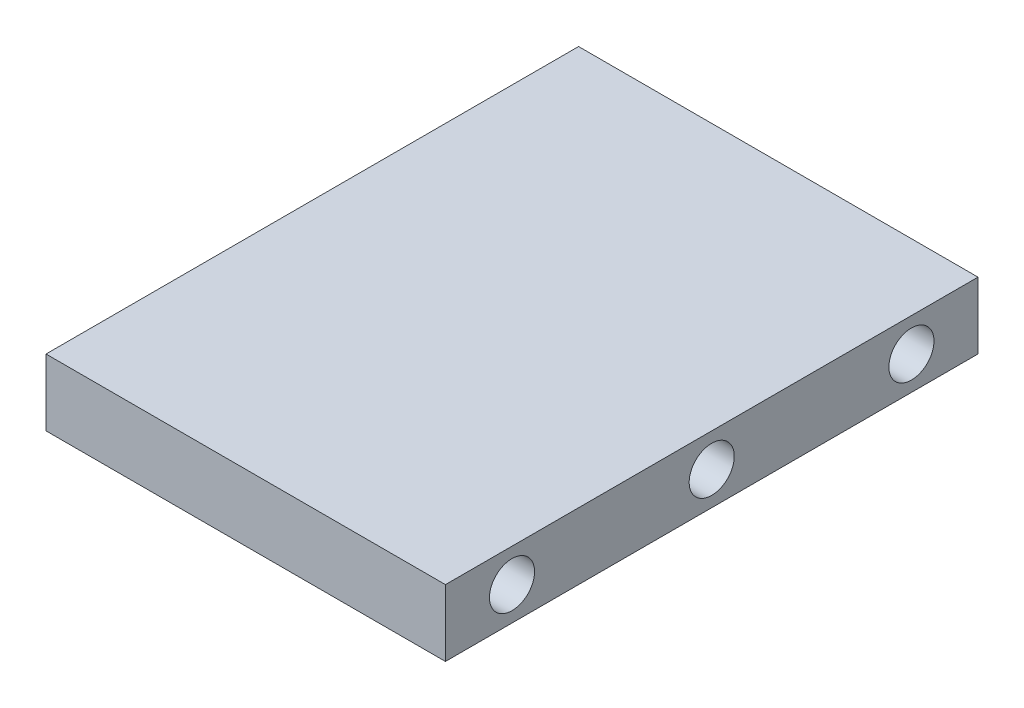
ISO-10303-21;
HEADER;
FILE_DESCRIPTION(('STEP AP214'),'2;1');
FILE_NAME('part.step','',(''),(''),'','','');
FILE_SCHEMA(('AUTOMOTIVE_DESIGN { 1 0 10303 214 1 1 1 1 }'));
ENDSEC;
DATA;
#1=APPLICATION_CONTEXT('core data for automotive mechanical design processes');
#2=APPLICATION_PROTOCOL_DEFINITION('international standard','automotive_design',2000,#1);
#3=PRODUCT_CONTEXT('',#1,'mechanical');
#4=PRODUCT('Part','Part','',(#3));
#5=PRODUCT_RELATED_PRODUCT_CATEGORY('part','',(#4));
#6=PRODUCT_DEFINITION_FORMATION('','',#4);
#7=PRODUCT_DEFINITION_CONTEXT('part definition',#1,'design');
#8=PRODUCT_DEFINITION('design','',#6,#7);
#9=PRODUCT_DEFINITION_SHAPE('','',#8);
#10=(LENGTH_UNIT() NAMED_UNIT(*) SI_UNIT(.MILLI.,.METRE.));
#11=(NAMED_UNIT(*) PLANE_ANGLE_UNIT() SI_UNIT($,.RADIAN.));
#12=(NAMED_UNIT(*) SI_UNIT($,.STERADIAN.) SOLID_ANGLE_UNIT());
#13=UNCERTAINTY_MEASURE_WITH_UNIT(LENGTH_MEASURE(1.E-05),#10,'distance_accuracy_value','');
#14=(GEOMETRIC_REPRESENTATION_CONTEXT(3) GLOBAL_UNCERTAINTY_ASSIGNED_CONTEXT((#13)) GLOBAL_UNIT_ASSIGNED_CONTEXT((#10,
#11,#12)) REPRESENTATION_CONTEXT('',''));
#15=CARTESIAN_POINT('',(0.,0.,0.));
#16=DIRECTION('',(0.,0.,1.));
#17=DIRECTION('',(1.,0.,0.));
#18=AXIS2_PLACEMENT_3D('',#15,#16,#17);
#19=CARTESIAN_POINT('',(19.05,6.35,25.4));
#20=DIRECTION('',(-1.,0.,0.));
#21=DIRECTION('',(0.,0.,1.));
#22=AXIS2_PLACEMENT_3D('',#19,#20,#21);
#23=PLANE('',#22);
#24=CARTESIAN_POINT('',(19.05,3.17500000000015,0.));
#25=DIRECTION('',(-1.,0.,0.));
#26=DIRECTION('',(0.,0.,1.));
#27=AXIS2_PLACEMENT_3D('',#24,#25,#26);
#28=CIRCLE('',#27,2.15265);
#29=CARTESIAN_POINT('',(19.05,3.17500000000015,2.15265));
#30=VERTEX_POINT('',#29);
#31=EDGE_CURVE('E121',#30,#30,#28,.T.);
#32=ORIENTED_EDGE('',*,*,#31,.T.);
#33=EDGE_LOOP('',(#32));
#34=FACE_BOUND('',#33,.T.);
#35=CARTESIAN_POINT('',(19.05,3.17500000000015,19.05));
#36=DIRECTION('',(-1.,0.,0.));
#37=DIRECTION('',(0.,0.,1.));
#38=AXIS2_PLACEMENT_3D('',#35,#36,#37);
#39=CIRCLE('',#38,2.15265);
#40=CARTESIAN_POINT('',(19.05,3.17500000000015,21.20265));
#41=VERTEX_POINT('',#40);
#42=EDGE_CURVE('E122',#41,#41,#39,.T.);
#43=ORIENTED_EDGE('',*,*,#42,.T.);
#44=EDGE_LOOP('',(#43));
#45=FACE_BOUND('',#44,.T.);
#46=CARTESIAN_POINT('',(19.05,3.17500000000015,-19.05));
#47=DIRECTION('',(-1.,0.,0.));
#48=DIRECTION('',(0.,0.,1.));
#49=AXIS2_PLACEMENT_3D('',#46,#47,#48);
#50=CIRCLE('',#49,2.15265);
#51=CARTESIAN_POINT('',(19.05,3.17500000000015,-16.89735));
#52=VERTEX_POINT('',#51);
#53=EDGE_CURVE('E116',#52,#52,#50,.T.);
#54=ORIENTED_EDGE('',*,*,#53,.T.);
#55=EDGE_LOOP('',(#54));
#56=FACE_BOUND('',#55,.T.);
#57=DIRECTION('',(0.,0.,-1.));
#58=VECTOR('',#57,1.);
#59=CARTESIAN_POINT('',(19.05,0.,25.4));
#60=LINE('',#59,#58);
#61=CARTESIAN_POINT('',(19.05,0.,25.4));
#62=VERTEX_POINT('',#61);
#63=CARTESIAN_POINT('',(19.05,0.,-25.4));
#64=VERTEX_POINT('',#63);
#65=EDGE_CURVE('E96',#62,#64,#60,.T.);
#66=ORIENTED_EDGE('',*,*,#65,.T.);
#67=DIRECTION('',(0.,-1.,0.));
#68=VECTOR('',#67,1.);
#69=CARTESIAN_POINT('',(19.05,6.35,-25.4));
#70=LINE('',#69,#68);
#71=CARTESIAN_POINT('',(19.05,6.35,-25.4));
#72=VERTEX_POINT('',#71);
#73=EDGE_CURVE('E11',#72,#64,#70,.T.);
#74=ORIENTED_EDGE('',*,*,#73,.F.);
#75=DIRECTION('',(0.,0.,-1.));
#76=VECTOR('',#75,1.);
#77=CARTESIAN_POINT('',(19.05,6.35,25.4));
#78=LINE('',#77,#76);
#79=CARTESIAN_POINT('',(19.05,6.35,25.4));
#80=VERTEX_POINT('',#79);
#81=EDGE_CURVE('E84',#80,#72,#78,.T.);
#82=ORIENTED_EDGE('',*,*,#81,.F.);
#83=DIRECTION('',(0.,-1.,0.));
#84=VECTOR('',#83,1.);
#85=CARTESIAN_POINT('',(19.05,6.35,25.4));
#86=LINE('',#85,#84);
#87=EDGE_CURVE('E92',#80,#62,#86,.T.);
#88=ORIENTED_EDGE('',*,*,#87,.T.);
#89=EDGE_LOOP('',(#66,#74,#82,#88));
#90=FACE_BOUND('',#89,.T.);
#91=ADVANCED_FACE('F33',(#34,#45,#56,#90),#23,.F.);
#92=CARTESIAN_POINT('',(-19.05,6.35,-25.4));
#93=DIRECTION('',(0.,0.,1.));
#94=DIRECTION('',(1.,0.,0.));
#95=AXIS2_PLACEMENT_3D('',#92,#93,#94);
#96=PLANE('',#95);
#97=DIRECTION('',(-1.,0.,0.));
#98=VECTOR('',#97,1.);
#99=CARTESIAN_POINT('',(-19.05,0.,-25.4));
#100=LINE('',#99,#98);
#101=CARTESIAN_POINT('',(-19.05,0.,-25.4));
#102=VERTEX_POINT('',#101);
#103=EDGE_CURVE('E88',#64,#102,#100,.T.);
#104=ORIENTED_EDGE('',*,*,#103,.T.);
#105=DIRECTION('',(0.,-1.,0.));
#106=VECTOR('',#105,1.);
#107=CARTESIAN_POINT('',(-19.05,6.35,-25.4));
#108=LINE('',#107,#106);
#109=CARTESIAN_POINT('',(-19.05,6.35,-25.4));
#110=VERTEX_POINT('',#109);
#111=EDGE_CURVE('E41',#110,#102,#108,.T.);
#112=ORIENTED_EDGE('',*,*,#111,.F.);
#113=DIRECTION('',(-1.,0.,0.));
#114=VECTOR('',#113,1.);
#115=CARTESIAN_POINT('',(-19.05,6.35,-25.4));
#116=LINE('',#115,#114);
#117=EDGE_CURVE('E79',#72,#110,#116,.T.);
#118=ORIENTED_EDGE('',*,*,#117,.F.);
#119=ORIENTED_EDGE('',*,*,#73,.T.);
#120=EDGE_LOOP('',(#104,#112,#118,#119));
#121=FACE_BOUND('',#120,.T.);
#122=ADVANCED_FACE('F87',(#121),#96,.F.);
#123=CARTESIAN_POINT('',(-19.05,6.35,25.4));
#124=DIRECTION('',(1.,0.,0.));
#125=DIRECTION('',(0.,0.,-1.));
#126=AXIS2_PLACEMENT_3D('',#123,#124,#125);
#127=PLANE('',#126);
#128=CARTESIAN_POINT('',(-19.05,3.17500000000015,0.));
#129=DIRECTION('',(-1.,0.,0.));
#130=DIRECTION('',(0.,0.,1.));
#131=AXIS2_PLACEMENT_3D('',#128,#129,#130);
#132=CIRCLE('',#131,2.15265);
#133=CARTESIAN_POINT('',(-19.05,3.17500000000015,2.15265));
#134=VERTEX_POINT('',#133);
#135=EDGE_CURVE('E112',#134,#134,#132,.T.);
#136=ORIENTED_EDGE('',*,*,#135,.F.);
#137=EDGE_LOOP('',(#136));
#138=FACE_BOUND('',#137,.T.);
#139=CARTESIAN_POINT('',(-19.05,3.17500000000015,19.05));
#140=DIRECTION('',(-1.,0.,0.));
#141=DIRECTION('',(0.,0.,1.));
#142=AXIS2_PLACEMENT_3D('',#139,#140,#141);
#143=CIRCLE('',#142,2.15265);
#144=CARTESIAN_POINT('',(-19.05,3.17500000000015,21.20265));
#145=VERTEX_POINT('',#144);
#146=EDGE_CURVE('E113',#145,#145,#143,.T.);
#147=ORIENTED_EDGE('',*,*,#146,.F.);
#148=EDGE_LOOP('',(#147));
#149=FACE_BOUND('',#148,.T.);
#150=CARTESIAN_POINT('',(-19.05,3.17500000000015,-19.05));
#151=DIRECTION('',(-1.,0.,0.));
#152=DIRECTION('',(0.,0.,1.));
#153=AXIS2_PLACEMENT_3D('',#150,#151,#152);
#154=CIRCLE('',#153,2.15265);
#155=CARTESIAN_POINT('',(-19.05,3.17500000000015,-16.89735));
#156=VERTEX_POINT('',#155);
#157=EDGE_CURVE('E99',#156,#156,#154,.T.);
#158=ORIENTED_EDGE('',*,*,#157,.F.);
#159=EDGE_LOOP('',(#158));
#160=FACE_BOUND('',#159,.T.);
#161=DIRECTION('',(0.,0.,1.));
#162=VECTOR('',#161,1.);
#163=CARTESIAN_POINT('',(-19.05,0.,25.4));
#164=LINE('',#163,#162);
#165=CARTESIAN_POINT('',(-19.05,0.,25.4));
#166=VERTEX_POINT('',#165);
#167=EDGE_CURVE('E66',#102,#166,#164,.T.);
#168=ORIENTED_EDGE('',*,*,#167,.T.);
#169=DIRECTION('',(0.,-1.,0.));
#170=VECTOR('',#169,1.);
#171=CARTESIAN_POINT('',(-19.05,6.35,25.4));
#172=LINE('',#171,#170);
#173=CARTESIAN_POINT('',(-19.05,6.35,25.4));
#174=VERTEX_POINT('',#173);
#175=EDGE_CURVE('E89',#174,#166,#172,.T.);
#176=ORIENTED_EDGE('',*,*,#175,.F.);
#177=DIRECTION('',(0.,0.,1.));
#178=VECTOR('',#177,1.);
#179=CARTESIAN_POINT('',(-19.05,6.35,25.4));
#180=LINE('',#179,#178);
#181=EDGE_CURVE('E82',#110,#174,#180,.T.);
#182=ORIENTED_EDGE('',*,*,#181,.F.);
#183=ORIENTED_EDGE('',*,*,#111,.T.);
#184=EDGE_LOOP('',(#168,#176,#182,#183));
#185=FACE_BOUND('',#184,.T.);
#186=ADVANCED_FACE('F90',(#138,#149,#160,#185),#127,.F.);
#187=CARTESIAN_POINT('',(-19.05,6.35,25.4));
#188=DIRECTION('',(0.,0.,-1.));
#189=DIRECTION('',(-1.,0.,0.));
#190=AXIS2_PLACEMENT_3D('',#187,#188,#189);
#191=PLANE('',#190);
#192=DIRECTION('',(1.,0.,0.));
#193=VECTOR('',#192,1.);
#194=CARTESIAN_POINT('',(-19.05,0.,25.4));
#195=LINE('',#194,#193);
#196=EDGE_CURVE('E72',#166,#62,#195,.T.);
#197=ORIENTED_EDGE('',*,*,#196,.T.);
#198=ORIENTED_EDGE('',*,*,#87,.F.);
#199=DIRECTION('',(1.,0.,0.));
#200=VECTOR('',#199,1.);
#201=CARTESIAN_POINT('',(-19.05,6.35,25.4));
#202=LINE('',#201,#200);
#203=EDGE_CURVE('E49',#174,#80,#202,.T.);
#204=ORIENTED_EDGE('',*,*,#203,.F.);
#205=ORIENTED_EDGE('',*,*,#175,.T.);
#206=EDGE_LOOP('',(#197,#198,#204,#205));
#207=FACE_BOUND('',#206,.T.);
#208=ADVANCED_FACE('F104',(#207),#191,.F.);
#209=CARTESIAN_POINT('',(0.,6.35,0.));
#210=DIRECTION('',(0.,-1.,0.));
#211=DIRECTION('',(0.,0.,-1.));
#212=AXIS2_PLACEMENT_3D('',#209,#210,#211);
#213=PLANE('',#212);
#214=ORIENTED_EDGE('',*,*,#81,.T.);
#215=ORIENTED_EDGE('',*,*,#117,.T.);
#216=ORIENTED_EDGE('',*,*,#181,.T.);
#217=ORIENTED_EDGE('',*,*,#203,.T.);
#218=EDGE_LOOP('',(#214,#215,#216,#217));
#219=FACE_BOUND('',#218,.T.);
#220=ADVANCED_FACE('F80',(#219),#213,.F.);
#221=CARTESIAN_POINT('',(0.,0.,0.));
#222=DIRECTION('',(0.,-1.,0.));
#223=DIRECTION('',(0.,0.,-1.));
#224=AXIS2_PLACEMENT_3D('',#221,#222,#223);
#225=PLANE('',#224);
#226=ORIENTED_EDGE('',*,*,#65,.F.);
#227=ORIENTED_EDGE('',*,*,#196,.F.);
#228=ORIENTED_EDGE('',*,*,#167,.F.);
#229=ORIENTED_EDGE('',*,*,#103,.F.);
#230=EDGE_LOOP('',(#226,#227,#228,#229));
#231=FACE_BOUND('',#230,.T.);
#232=ADVANCED_FACE('F107',(#231),#225,.T.);
#233=CARTESIAN_POINT('',(6.34999999999999,3.17500000000015,-19.05));
#234=DIRECTION('',(-1.,0.,0.));
#235=DIRECTION('',(0.,0.,1.));
#236=AXIS2_PLACEMENT_3D('',#233,#234,#235);
#237=CYLINDRICAL_SURFACE('',#236,2.15265);
#238=ORIENTED_EDGE('',*,*,#53,.F.);
#239=EDGE_LOOP('',(#238));
#240=FACE_BOUND('',#239,.T.);
#241=ORIENTED_EDGE('',*,*,#157,.T.);
#242=EDGE_LOOP('',(#241));
#243=FACE_BOUND('',#242,.T.);
#244=ADVANCED_FACE('F144',(#240,#243),#237,.F.);
#245=CARTESIAN_POINT('',(6.34999999999999,3.17500000000015,19.05));
#246=DIRECTION('',(-1.,0.,0.));
#247=DIRECTION('',(0.,0.,1.));
#248=AXIS2_PLACEMENT_3D('',#245,#246,#247);
#249=CYLINDRICAL_SURFACE('',#248,2.15265);
#250=ORIENTED_EDGE('',*,*,#42,.F.);
#251=EDGE_LOOP('',(#250));
#252=FACE_BOUND('',#251,.T.);
#253=ORIENTED_EDGE('',*,*,#146,.T.);
#254=EDGE_LOOP('',(#253));
#255=FACE_BOUND('',#254,.T.);
#256=ADVANCED_FACE('F133',(#252,#255),#249,.F.);
#257=CARTESIAN_POINT('',(6.34999999999999,3.17500000000015,0.));
#258=DIRECTION('',(-1.,0.,0.));
#259=DIRECTION('',(0.,0.,1.));
#260=AXIS2_PLACEMENT_3D('',#257,#258,#259);
#261=CYLINDRICAL_SURFACE('',#260,2.15265);
#262=ORIENTED_EDGE('',*,*,#31,.F.);
#263=EDGE_LOOP('',(#262));
#264=FACE_BOUND('',#263,.T.);
#265=ORIENTED_EDGE('',*,*,#135,.T.);
#266=EDGE_LOOP('',(#265));
#267=FACE_BOUND('',#266,.T.);
#268=ADVANCED_FACE('F130',(#264,#267),#261,.F.);
#269=CLOSED_SHELL('',(#91,#122,#186,#208,#220,#232,#244,#256,#268));
#270=MANIFOLD_SOLID_BREP('B2',#269);
#271=ADVANCED_BREP_SHAPE_REPRESENTATION('',(#18,#270),#14);
#272=SHAPE_DEFINITION_REPRESENTATION(#9,#271);
ENDSEC;
END-ISO-10303-21;
